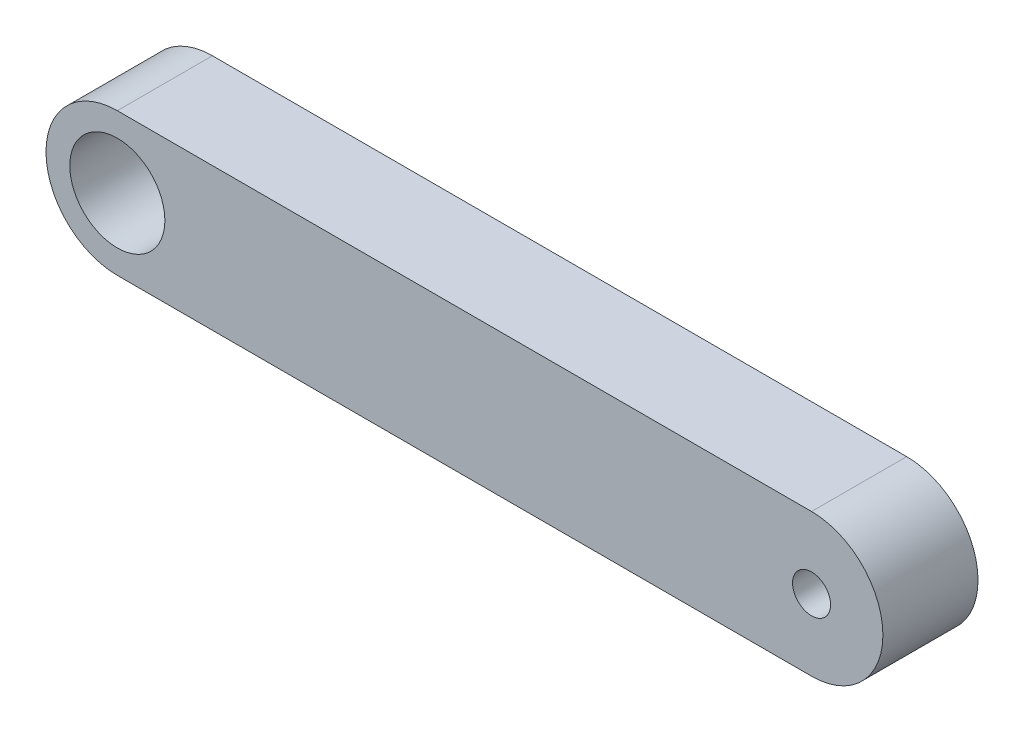
ISO-10303-21;
HEADER;
FILE_DESCRIPTION(('STEP AP214'),'2;1');
FILE_NAME('part.step','',(''),(''),'','','');
FILE_SCHEMA(('AUTOMOTIVE_DESIGN { 1 0 10303 214 1 1 1 1 }'));
ENDSEC;
DATA;
#1=APPLICATION_CONTEXT('core data for automotive mechanical design processes');
#2=APPLICATION_PROTOCOL_DEFINITION('international standard','automotive_design',2000,#1);
#3=PRODUCT_CONTEXT('',#1,'mechanical');
#4=PRODUCT('Part','Part','',(#3));
#5=PRODUCT_RELATED_PRODUCT_CATEGORY('part','',(#4));
#6=PRODUCT_DEFINITION_FORMATION('','',#4);
#7=PRODUCT_DEFINITION_CONTEXT('part definition',#1,'design');
#8=PRODUCT_DEFINITION('design','',#6,#7);
#9=PRODUCT_DEFINITION_SHAPE('','',#8);
#10=(LENGTH_UNIT() NAMED_UNIT(*) SI_UNIT(.MILLI.,.METRE.));
#11=(NAMED_UNIT(*) PLANE_ANGLE_UNIT() SI_UNIT($,.RADIAN.));
#12=(NAMED_UNIT(*) SI_UNIT($,.STERADIAN.) SOLID_ANGLE_UNIT());
#13=UNCERTAINTY_MEASURE_WITH_UNIT(LENGTH_MEASURE(1.E-05),#10,'distance_accuracy_value','');
#14=(GEOMETRIC_REPRESENTATION_CONTEXT(3) GLOBAL_UNCERTAINTY_ASSIGNED_CONTEXT((#13)) GLOBAL_UNIT_ASSIGNED_CONTEXT((#10,
#11,#12)) REPRESENTATION_CONTEXT('',''));
#15=CARTESIAN_POINT('',(0.,0.,0.));
#16=DIRECTION('',(0.,0.,1.));
#17=DIRECTION('',(1.,0.,0.));
#18=AXIS2_PLACEMENT_3D('',#15,#16,#17);
#19=CARTESIAN_POINT('',(0.,0.,10.));
#20=DIRECTION('',(0.,0.,-1.));
#21=DIRECTION('',(-1.,0.,0.));
#22=AXIS2_PLACEMENT_3D('',#19,#20,#21);
#23=CYLINDRICAL_SURFACE('',#22,7.5);
#24=CARTESIAN_POINT('',(0.,0.,0.));
#25=DIRECTION('',(0.,0.,1.));
#26=DIRECTION('',(1.,0.,0.));
#27=AXIS2_PLACEMENT_3D('',#24,#25,#26);
#28=CIRCLE('',#27,7.5);
#29=CARTESIAN_POINT('',(0.,-7.5,0.));
#30=VERTEX_POINT('',#29);
#31=CARTESIAN_POINT('',(0.,7.5,0.));
#32=VERTEX_POINT('',#31);
#33=EDGE_CURVE('E96',#30,#32,#28,.T.);
#34=ORIENTED_EDGE('',*,*,#33,.T.);
#35=DIRECTION('',(0.,0.,-1.));
#36=VECTOR('',#35,1.);
#37=CARTESIAN_POINT('',(0.,7.5,10.));
#38=LINE('',#37,#36);
#39=CARTESIAN_POINT('',(0.,7.5,10.));
#40=VERTEX_POINT('',#39);
#41=EDGE_CURVE('E11',#40,#32,#38,.T.);
#42=ORIENTED_EDGE('',*,*,#41,.F.);
#43=CARTESIAN_POINT('',(0.,0.,10.));
#44=DIRECTION('',(0.,0.,1.));
#45=DIRECTION('',(1.,0.,0.));
#46=AXIS2_PLACEMENT_3D('',#43,#44,#45);
#47=CIRCLE('',#46,7.5);
#48=CARTESIAN_POINT('',(0.,-7.5,10.));
#49=VERTEX_POINT('',#48);
#50=EDGE_CURVE('E84',#49,#40,#47,.T.);
#51=ORIENTED_EDGE('',*,*,#50,.F.);
#52=DIRECTION('',(0.,0.,-1.));
#53=VECTOR('',#52,1.);
#54=CARTESIAN_POINT('',(0.,-7.5,10.));
#55=LINE('',#54,#53);
#56=EDGE_CURVE('E92',#49,#30,#55,.T.);
#57=ORIENTED_EDGE('',*,*,#56,.T.);
#58=EDGE_LOOP('',(#34,#42,#51,#57));
#59=FACE_BOUND('',#58,.T.);
#60=ADVANCED_FACE('F33',(#59),#23,.T.);
#61=CARTESIAN_POINT('',(0.,7.5,10.));
#62=DIRECTION('',(0.,-1.,0.));
#63=DIRECTION('',(1.,0.,0.));
#64=AXIS2_PLACEMENT_3D('',#61,#62,#63);
#65=PLANE('',#64);
#66=DIRECTION('',(-1.,0.,0.));
#67=VECTOR('',#66,1.);
#68=CARTESIAN_POINT('',(0.,7.5,0.));
#69=LINE('',#68,#67);
#70=CARTESIAN_POINT('',(-73.,7.49999999999997,0.));
#71=VERTEX_POINT('',#70);
#72=EDGE_CURVE('E88',#32,#71,#69,.T.);
#73=ORIENTED_EDGE('',*,*,#72,.T.);
#74=DIRECTION('',(0.,0.,-1.));
#75=VECTOR('',#74,1.);
#76=CARTESIAN_POINT('',(-73.,7.49999999999997,10.));
#77=LINE('',#76,#75);
#78=CARTESIAN_POINT('',(-73.,7.49999999999997,10.));
#79=VERTEX_POINT('',#78);
#80=EDGE_CURVE('E41',#79,#71,#77,.T.);
#81=ORIENTED_EDGE('',*,*,#80,.F.);
#82=DIRECTION('',(-1.,0.,0.));
#83=VECTOR('',#82,1.);
#84=CARTESIAN_POINT('',(0.,7.5,10.));
#85=LINE('',#84,#83);
#86=EDGE_CURVE('E79',#40,#79,#85,.T.);
#87=ORIENTED_EDGE('',*,*,#86,.F.);
#88=ORIENTED_EDGE('',*,*,#41,.T.);
#89=EDGE_LOOP('',(#73,#81,#87,#88));
#90=FACE_BOUND('',#89,.T.);
#91=ADVANCED_FACE('F87',(#90),#65,.F.);
#92=CARTESIAN_POINT('',(-73.,0.,10.));
#93=DIRECTION('',(0.,0.,-1.));
#94=DIRECTION('',(-1.,0.,0.));
#95=AXIS2_PLACEMENT_3D('',#92,#93,#94);
#96=CYLINDRICAL_SURFACE('',#95,7.49999999999998);
#97=CARTESIAN_POINT('',(-73.,0.,0.));
#98=DIRECTION('',(0.,0.,1.));
#99=DIRECTION('',(1.,0.,0.));
#100=AXIS2_PLACEMENT_3D('',#97,#98,#99);
#101=CIRCLE('',#100,7.49999999999998);
#102=CARTESIAN_POINT('',(-73.,-7.49999999999999,0.));
#103=VERTEX_POINT('',#102);
#104=EDGE_CURVE('E66',#71,#103,#101,.T.);
#105=ORIENTED_EDGE('',*,*,#104,.T.);
#106=DIRECTION('',(0.,0.,-1.));
#107=VECTOR('',#106,1.);
#108=CARTESIAN_POINT('',(-73.,-7.49999999999999,10.));
#109=LINE('',#108,#107);
#110=CARTESIAN_POINT('',(-73.,-7.49999999999999,10.));
#111=VERTEX_POINT('',#110);
#112=EDGE_CURVE('E89',#111,#103,#109,.T.);
#113=ORIENTED_EDGE('',*,*,#112,.F.);
#114=CARTESIAN_POINT('',(-73.,0.,10.));
#115=DIRECTION('',(0.,0.,1.));
#116=DIRECTION('',(1.,0.,0.));
#117=AXIS2_PLACEMENT_3D('',#114,#115,#116);
#118=CIRCLE('',#117,7.49999999999998);
#119=EDGE_CURVE('E82',#79,#111,#118,.T.);
#120=ORIENTED_EDGE('',*,*,#119,.F.);
#121=ORIENTED_EDGE('',*,*,#80,.T.);
#122=EDGE_LOOP('',(#105,#113,#120,#121));
#123=FACE_BOUND('',#122,.T.);
#124=ADVANCED_FACE('F90',(#123),#96,.T.);
#125=CARTESIAN_POINT('',(0.,-7.5,10.));
#126=DIRECTION('',(0.,1.,0.));
#127=DIRECTION('',(-1.,0.,0.));
#128=AXIS2_PLACEMENT_3D('',#125,#126,#127);
#129=PLANE('',#128);
#130=DIRECTION('',(1.,0.,0.));
#131=VECTOR('',#130,1.);
#132=CARTESIAN_POINT('',(0.,-7.5,0.));
#133=LINE('',#132,#131);
#134=EDGE_CURVE('E72',#103,#30,#133,.T.);
#135=ORIENTED_EDGE('',*,*,#134,.T.);
#136=ORIENTED_EDGE('',*,*,#56,.F.);
#137=DIRECTION('',(1.,0.,0.));
#138=VECTOR('',#137,1.);
#139=CARTESIAN_POINT('',(0.,-7.5,10.));
#140=LINE('',#139,#138);
#141=EDGE_CURVE('E49',#111,#49,#140,.T.);
#142=ORIENTED_EDGE('',*,*,#141,.F.);
#143=ORIENTED_EDGE('',*,*,#112,.T.);
#144=EDGE_LOOP('',(#135,#136,#142,#143));
#145=FACE_BOUND('',#144,.T.);
#146=ADVANCED_FACE('F104',(#145),#129,.F.);
#147=CARTESIAN_POINT('',(0.,0.,10.));
#148=DIRECTION('',(0.,0.,1.));
#149=DIRECTION('',(1.,0.,0.));
#150=AXIS2_PLACEMENT_3D('',#147,#148,#149);
#151=PLANE('',#150);
#152=CARTESIAN_POINT('',(-73.,0.,10.));
#153=DIRECTION('',(0.,0.,1.));
#154=DIRECTION('',(1.,0.,0.));
#155=AXIS2_PLACEMENT_3D('',#152,#153,#154);
#156=CIRCLE('',#155,5.);
#157=CARTESIAN_POINT('',(-68.,0.,10.));
#158=VERTEX_POINT('',#157);
#159=EDGE_CURVE('E116',#158,#158,#156,.T.);
#160=ORIENTED_EDGE('',*,*,#159,.F.);
#161=EDGE_LOOP('',(#160));
#162=FACE_BOUND('',#161,.T.);
#163=CARTESIAN_POINT('',(0.,0.,10.));
#164=DIRECTION('',(0.,0.,1.));
#165=DIRECTION('',(1.,0.,0.));
#166=AXIS2_PLACEMENT_3D('',#163,#164,#165);
#167=CIRCLE('',#166,2.);
#168=CARTESIAN_POINT('',(2.,0.,10.));
#169=VERTEX_POINT('',#168);
#170=EDGE_CURVE('E110',#169,#169,#167,.T.);
#171=ORIENTED_EDGE('',*,*,#170,.F.);
#172=EDGE_LOOP('',(#171));
#173=FACE_BOUND('',#172,.T.);
#174=ORIENTED_EDGE('',*,*,#50,.T.);
#175=ORIENTED_EDGE('',*,*,#86,.T.);
#176=ORIENTED_EDGE('',*,*,#119,.T.);
#177=ORIENTED_EDGE('',*,*,#141,.T.);
#178=EDGE_LOOP('',(#174,#175,#176,#177));
#179=FACE_BOUND('',#178,.T.);
#180=ADVANCED_FACE('F80',(#162,#173,#179),#151,.T.);
#181=CARTESIAN_POINT('',(0.,0.,0.));
#182=DIRECTION('',(0.,0.,1.));
#183=DIRECTION('',(1.,0.,0.));
#184=AXIS2_PLACEMENT_3D('',#181,#182,#183);
#185=PLANE('',#184);
#186=CARTESIAN_POINT('',(-73.,0.,0.));
#187=DIRECTION('',(0.,0.,1.));
#188=DIRECTION('',(1.,0.,0.));
#189=AXIS2_PLACEMENT_3D('',#186,#187,#188);
#190=CIRCLE('',#189,5.);
#191=CARTESIAN_POINT('',(-68.,0.,0.));
#192=VERTEX_POINT('',#191);
#193=EDGE_CURVE('E99',#192,#192,#190,.T.);
#194=ORIENTED_EDGE('',*,*,#193,.T.);
#195=EDGE_LOOP('',(#194));
#196=FACE_BOUND('',#195,.T.);
#197=CARTESIAN_POINT('',(0.,0.,0.));
#198=DIRECTION('',(0.,0.,1.));
#199=DIRECTION('',(1.,0.,0.));
#200=AXIS2_PLACEMENT_3D('',#197,#198,#199);
#201=CIRCLE('',#200,2.);
#202=CARTESIAN_POINT('',(2.,0.,0.));
#203=VERTEX_POINT('',#202);
#204=EDGE_CURVE('E113',#203,#203,#201,.T.);
#205=ORIENTED_EDGE('',*,*,#204,.T.);
#206=EDGE_LOOP('',(#205));
#207=FACE_BOUND('',#206,.T.);
#208=ORIENTED_EDGE('',*,*,#33,.F.);
#209=ORIENTED_EDGE('',*,*,#134,.F.);
#210=ORIENTED_EDGE('',*,*,#104,.F.);
#211=ORIENTED_EDGE('',*,*,#72,.F.);
#212=EDGE_LOOP('',(#208,#209,#210,#211));
#213=FACE_BOUND('',#212,.T.);
#214=ADVANCED_FACE('F107',(#196,#207,#213),#185,.F.);
#215=CARTESIAN_POINT('',(0.,0.,0.));
#216=DIRECTION('',(0.,0.,1.));
#217=DIRECTION('',(1.,0.,0.));
#218=AXIS2_PLACEMENT_3D('',#215,#216,#217);
#219=CYLINDRICAL_SURFACE('',#218,2.);
#220=ORIENTED_EDGE('',*,*,#204,.F.);
#221=EDGE_LOOP('',(#220));
#222=FACE_BOUND('',#221,.T.);
#223=ORIENTED_EDGE('',*,*,#170,.T.);
#224=EDGE_LOOP('',(#223));
#225=FACE_BOUND('',#224,.T.);
#226=ADVANCED_FACE('F127',(#222,#225),#219,.F.);
#227=CARTESIAN_POINT('',(-73.,0.,0.));
#228=DIRECTION('',(0.,0.,1.));
#229=DIRECTION('',(1.,0.,0.));
#230=AXIS2_PLACEMENT_3D('',#227,#228,#229);
#231=CYLINDRICAL_SURFACE('',#230,5.);
#232=ORIENTED_EDGE('',*,*,#193,.F.);
#233=EDGE_LOOP('',(#232));
#234=FACE_BOUND('',#233,.T.);
#235=ORIENTED_EDGE('',*,*,#159,.T.);
#236=EDGE_LOOP('',(#235));
#237=FACE_BOUND('',#236,.T.);
#238=ADVANCED_FACE('F124',(#234,#237),#231,.F.);
#239=CLOSED_SHELL('',(#60,#91,#124,#146,#180,#214,#226,#238));
#240=MANIFOLD_SOLID_BREP('B2',#239);
#241=ADVANCED_BREP_SHAPE_REPRESENTATION('',(#18,#240),#14);
#242=SHAPE_DEFINITION_REPRESENTATION(#9,#241);
ENDSEC;
END-ISO-10303-21;
